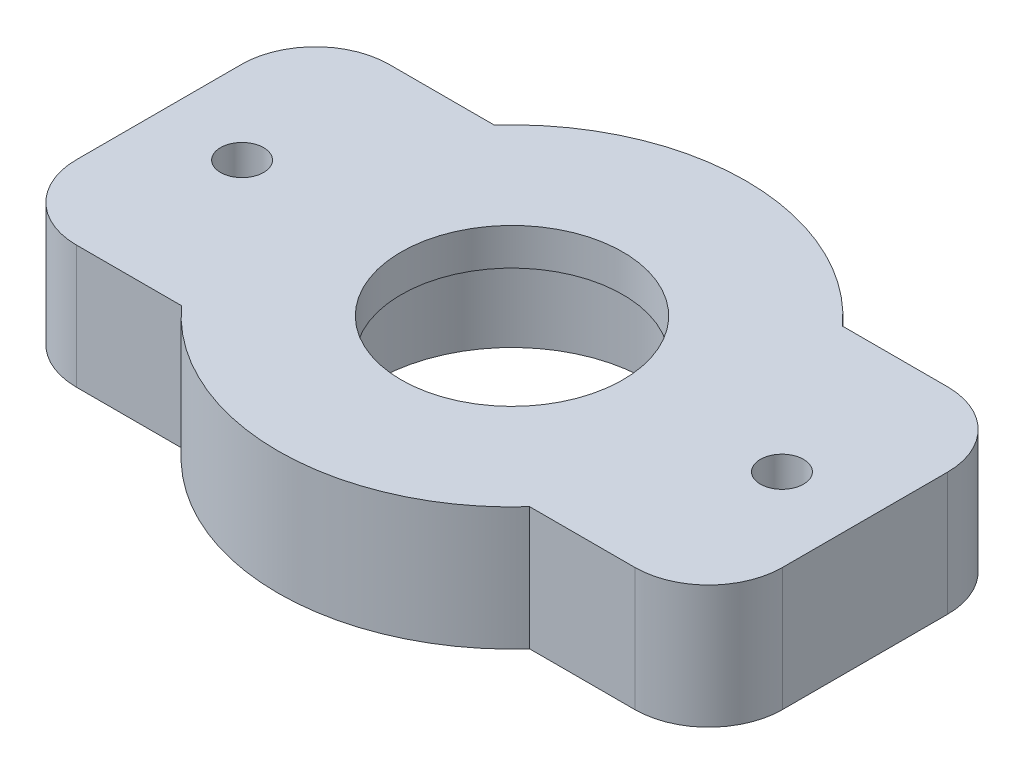
ISO-10303-21;
HEADER;
FILE_DESCRIPTION(('STEP AP214'),'2;1');
FILE_NAME('part.step','',(''),(''),'','','');
FILE_SCHEMA(('AUTOMOTIVE_DESIGN { 1 0 10303 214 1 1 1 1 }'));
ENDSEC;
DATA;
#1=APPLICATION_CONTEXT('core data for automotive mechanical design processes');
#2=APPLICATION_PROTOCOL_DEFINITION('international standard','automotive_design',2000,#1);
#3=PRODUCT_CONTEXT('',#1,'mechanical');
#4=PRODUCT('Part','Part','',(#3));
#5=PRODUCT_RELATED_PRODUCT_CATEGORY('part','',(#4));
#6=PRODUCT_DEFINITION_FORMATION('','',#4);
#7=PRODUCT_DEFINITION_CONTEXT('part definition',#1,'design');
#8=PRODUCT_DEFINITION('design','',#6,#7);
#9=PRODUCT_DEFINITION_SHAPE('','',#8);
#10=(LENGTH_UNIT() NAMED_UNIT(*) SI_UNIT(.MILLI.,.METRE.));
#11=(NAMED_UNIT(*) PLANE_ANGLE_UNIT() SI_UNIT($,.RADIAN.));
#12=(NAMED_UNIT(*) SI_UNIT($,.STERADIAN.) SOLID_ANGLE_UNIT());
#13=UNCERTAINTY_MEASURE_WITH_UNIT(LENGTH_MEASURE(1.E-05),#10,'distance_accuracy_value','');
#14=(GEOMETRIC_REPRESENTATION_CONTEXT(3) GLOBAL_UNCERTAINTY_ASSIGNED_CONTEXT((#13)) GLOBAL_UNIT_ASSIGNED_CONTEXT((#10,
#11,#12)) REPRESENTATION_CONTEXT('',''));
#15=CARTESIAN_POINT('',(0.,0.,0.));
#16=DIRECTION('',(0.,0.,1.));
#17=DIRECTION('',(1.,0.,0.));
#18=AXIS2_PLACEMENT_3D('',#15,#16,#17);
#19=CARTESIAN_POINT('',(0.,10.,0.));
#20=DIRECTION('',(0.,-1.,0.));
#21=DIRECTION('',(0.,0.,-1.));
#22=AXIS2_PLACEMENT_3D('',#19,#20,#21);
#23=CYLINDRICAL_SURFACE('',#22,11.);
#24=CARTESIAN_POINT('',(0.,0.,0.));
#25=DIRECTION('',(0.,1.,0.));
#26=DIRECTION('',(0.,0.,1.));
#27=AXIS2_PLACEMENT_3D('',#24,#25,#26);
#28=CIRCLE('',#27,11.);
#29=CARTESIAN_POINT('',(0.,0.,11.));
#30=VERTEX_POINT('',#29);
#31=EDGE_CURVE('E246',#30,#30,#28,.T.);
#32=ORIENTED_EDGE('',*,*,#31,.F.);
#33=EDGE_LOOP('',(#32));
#34=FACE_BOUND('',#33,.T.);
#35=CARTESIAN_POINT('',(0.,7.,0.));
#36=DIRECTION('',(0.,1.,0.));
#37=DIRECTION('',(0.,0.,1.));
#38=AXIS2_PLACEMENT_3D('',#35,#36,#37);
#39=CIRCLE('',#38,11.);
#40=CARTESIAN_POINT('',(0.,7.,11.));
#41=VERTEX_POINT('',#40);
#42=EDGE_CURVE('E440',#41,#41,#39,.T.);
#43=ORIENTED_EDGE('',*,*,#42,.T.);
#44=EDGE_LOOP('',(#43));
#45=FACE_BOUND('',#44,.T.);
#46=ADVANCED_FACE('F32',(#34,#45),#23,.F.);
#47=CARTESIAN_POINT('',(0.,10.,0.));
#48=DIRECTION('',(0.,1.,0.));
#49=DIRECTION('',(0.,0.,1.));
#50=AXIS2_PLACEMENT_3D('',#47,#48,#49);
#51=PLANE('',#50);
#52=CARTESIAN_POINT('',(21.920310216783,10.,0.));
#53=DIRECTION('',(0.,1.,0.));
#54=DIRECTION('',(0.,0.,1.));
#55=AXIS2_PLACEMENT_3D('',#52,#53,#54);
#56=CIRCLE('',#55,1.75);
#57=CARTESIAN_POINT('',(21.920310216783,10.,1.75));
#58=VERTEX_POINT('',#57);
#59=EDGE_CURVE('E421',#58,#58,#56,.T.);
#60=ORIENTED_EDGE('',*,*,#59,.F.);
#61=EDGE_LOOP('',(#60));
#62=FACE_BOUND('',#61,.T.);
#63=DIRECTION('',(0.,0.,-1.));
#64=VECTOR('',#63,1.);
#65=CARTESIAN_POINT('',(28.670310216783,10.,12.7));
#66=LINE('',#65,#64);
#67=CARTESIAN_POINT('',(28.670310216783,10.,6.7));
#68=VERTEX_POINT('',#67);
#69=CARTESIAN_POINT('',(28.670310216783,10.,-6.7));
#70=VERTEX_POINT('',#69);
#71=EDGE_CURVE('E238',#68,#70,#66,.T.);
#72=ORIENTED_EDGE('',*,*,#71,.T.);
#73=CARTESIAN_POINT('',(22.670310216783,10.,-6.7));
#74=DIRECTION('',(0.,1.,0.));
#75=DIRECTION('',(0.,0.,1.));
#76=AXIS2_PLACEMENT_3D('',#73,#74,#75);
#77=CIRCLE('',#76,6.);
#78=CARTESIAN_POINT('',(22.670310216783,10.,-12.7));
#79=VERTEX_POINT('',#78);
#80=EDGE_CURVE('E177',#70,#79,#77,.T.);
#81=ORIENTED_EDGE('',*,*,#80,.T.);
#82=DIRECTION('',(-1.,0.,0.));
#83=VECTOR('',#82,1.);
#84=CARTESIAN_POINT('',(28.670310216783,10.,-12.7));
#85=LINE('',#84,#83);
#86=CARTESIAN_POINT('',(14.1318788559767,10.,-12.7));
#87=VERTEX_POINT('',#86);
#88=EDGE_CURVE('E140',#79,#87,#85,.T.);
#89=ORIENTED_EDGE('',*,*,#88,.T.);
#90=CARTESIAN_POINT('',(0.,10.,0.));
#91=DIRECTION('',(0.,1.,0.));
#92=DIRECTION('',(0.,0.,1.));
#93=AXIS2_PLACEMENT_3D('',#90,#91,#92);
#94=CIRCLE('',#93,19.);
#95=CARTESIAN_POINT('',(-14.1318788559767,10.,-12.7));
#96=VERTEX_POINT('',#95);
#97=EDGE_CURVE('E133',#87,#96,#94,.T.);
#98=ORIENTED_EDGE('',*,*,#97,.T.);
#99=DIRECTION('',(-1.,0.,0.));
#100=VECTOR('',#99,1.);
#101=CARTESIAN_POINT('',(-14.1318788559767,10.,-12.7));
#102=LINE('',#101,#100);
#103=CARTESIAN_POINT('',(-22.670310216783,10.,-12.7));
#104=VERTEX_POINT('',#103);
#105=EDGE_CURVE('E123',#96,#104,#102,.T.);
#106=ORIENTED_EDGE('',*,*,#105,.T.);
#107=CARTESIAN_POINT('',(-22.670310216783,10.,-6.7));
#108=DIRECTION('',(0.,1.,0.));
#109=DIRECTION('',(0.,0.,1.));
#110=AXIS2_PLACEMENT_3D('',#107,#108,#109);
#111=CIRCLE('',#110,6.);
#112=CARTESIAN_POINT('',(-28.670310216783,10.,-6.7));
#113=VERTEX_POINT('',#112);
#114=EDGE_CURVE('E172',#104,#113,#111,.T.);
#115=ORIENTED_EDGE('',*,*,#114,.T.);
#116=DIRECTION('',(0.,0.,1.));
#117=VECTOR('',#116,1.);
#118=CARTESIAN_POINT('',(-28.670310216783,10.,12.7));
#119=LINE('',#118,#117);
#120=CARTESIAN_POINT('',(-28.670310216783,10.,6.7));
#121=VERTEX_POINT('',#120);
#122=EDGE_CURVE('E132',#113,#121,#119,.T.);
#123=ORIENTED_EDGE('',*,*,#122,.T.);
#124=CARTESIAN_POINT('',(-22.670310216783,10.,6.7));
#125=DIRECTION('',(0.,1.,0.));
#126=DIRECTION('',(0.,0.,1.));
#127=AXIS2_PLACEMENT_3D('',#124,#125,#126);
#128=CIRCLE('',#127,6.);
#129=CARTESIAN_POINT('',(-22.670310216783,10.,12.7));
#130=VERTEX_POINT('',#129);
#131=EDGE_CURVE('E55',#121,#130,#128,.T.);
#132=ORIENTED_EDGE('',*,*,#131,.T.);
#133=DIRECTION('',(1.,0.,0.));
#134=VECTOR('',#133,1.);
#135=CARTESIAN_POINT('',(-14.1318788559767,10.,12.7));
#136=LINE('',#135,#134);
#137=CARTESIAN_POINT('',(-14.1318788559767,10.,12.7));
#138=VERTEX_POINT('',#137);
#139=EDGE_CURVE('E194',#130,#138,#136,.T.);
#140=ORIENTED_EDGE('',*,*,#139,.T.);
#141=CARTESIAN_POINT('',(0.,10.,0.));
#142=DIRECTION('',(0.,1.,0.));
#143=DIRECTION('',(0.,0.,1.));
#144=AXIS2_PLACEMENT_3D('',#141,#142,#143);
#145=CIRCLE('',#144,19.);
#146=CARTESIAN_POINT('',(14.1318788559767,10.,12.7));
#147=VERTEX_POINT('',#146);
#148=EDGE_CURVE('E242',#138,#147,#145,.T.);
#149=ORIENTED_EDGE('',*,*,#148,.T.);
#150=DIRECTION('',(1.,0.,0.));
#151=VECTOR('',#150,1.);
#152=CARTESIAN_POINT('',(28.670310216783,10.,12.7));
#153=LINE('',#152,#151);
#154=CARTESIAN_POINT('',(22.670310216783,10.,12.7));
#155=VERTEX_POINT('',#154);
#156=EDGE_CURVE('E226',#147,#155,#153,.T.);
#157=ORIENTED_EDGE('',*,*,#156,.T.);
#158=CARTESIAN_POINT('',(22.670310216783,10.,6.7));
#159=DIRECTION('',(0.,1.,0.));
#160=DIRECTION('',(0.,0.,1.));
#161=AXIS2_PLACEMENT_3D('',#158,#159,#160);
#162=CIRCLE('',#161,6.);
#163=EDGE_CURVE('E175',#155,#68,#162,.T.);
#164=ORIENTED_EDGE('',*,*,#163,.T.);
#165=EDGE_LOOP('',(#72,#81,#89,#98,#106,#115,#123,#132,#140,#149,#157,#164));
#166=FACE_BOUND('',#165,.T.);
#167=CARTESIAN_POINT('',(-21.920310216783,10.,0.));
#168=DIRECTION('',(0.,1.,0.));
#169=DIRECTION('',(0.,0.,1.));
#170=AXIS2_PLACEMENT_3D('',#167,#168,#169);
#171=CIRCLE('',#170,1.75);
#172=CARTESIAN_POINT('',(-21.920310216783,10.,1.75));
#173=VERTEX_POINT('',#172);
#174=EDGE_CURVE('E426',#173,#173,#171,.T.);
#175=ORIENTED_EDGE('',*,*,#174,.F.);
#176=EDGE_LOOP('',(#175));
#177=FACE_BOUND('',#176,.T.);
#178=CARTESIAN_POINT('',(0.,10.,0.));
#179=DIRECTION('',(0.,1.,0.));
#180=DIRECTION('',(0.,0.,1.));
#181=AXIS2_PLACEMENT_3D('',#178,#179,#180);
#182=CIRCLE('',#181,9.);
#183=CARTESIAN_POINT('',(0.,10.,9.));
#184=VERTEX_POINT('',#183);
#185=EDGE_CURVE('E445',#184,#184,#182,.T.);
#186=ORIENTED_EDGE('',*,*,#185,.F.);
#187=EDGE_LOOP('',(#186));
#188=FACE_BOUND('',#187,.T.);
#189=ADVANCED_FACE('F137',(#62,#166,#177,#188),#51,.T.);
#190=CARTESIAN_POINT('',(0.,0.,0.));
#191=DIRECTION('',(0.,1.,0.));
#192=DIRECTION('',(0.,0.,1.));
#193=AXIS2_PLACEMENT_3D('',#190,#191,#192);
#194=PLANE('',#193);
#195=DIRECTION('',(-1.,0.,0.));
#196=VECTOR('',#195,1.);
#197=CARTESIAN_POINT('',(28.670310216783,0.,-12.7));
#198=LINE('',#197,#196);
#199=CARTESIAN_POINT('',(22.670310216783,0.,-12.7));
#200=VERTEX_POINT('',#199);
#201=CARTESIAN_POINT('',(14.1318788559767,0.,-12.7));
#202=VERTEX_POINT('',#201);
#203=EDGE_CURVE('E144',#200,#202,#198,.T.);
#204=ORIENTED_EDGE('',*,*,#203,.F.);
#205=CARTESIAN_POINT('',(22.670310216783,0.,-6.7));
#206=DIRECTION('',(0.,1.,0.));
#207=DIRECTION('',(0.,0.,1.));
#208=AXIS2_PLACEMENT_3D('',#205,#206,#207);
#209=CIRCLE('',#208,6.);
#210=CARTESIAN_POINT('',(28.670310216783,0.,-6.7));
#211=VERTEX_POINT('',#210);
#212=EDGE_CURVE('E165',#200,#211,#209,.F.);
#213=ORIENTED_EDGE('',*,*,#212,.T.);
#214=DIRECTION('',(0.,0.,-1.));
#215=VECTOR('',#214,1.);
#216=CARTESIAN_POINT('',(28.670310216783,0.,12.7));
#217=LINE('',#216,#215);
#218=CARTESIAN_POINT('',(28.670310216783,0.,6.7));
#219=VERTEX_POINT('',#218);
#220=EDGE_CURVE('E218',#219,#211,#217,.T.);
#221=ORIENTED_EDGE('',*,*,#220,.F.);
#222=CARTESIAN_POINT('',(22.670310216783,0.,6.7));
#223=DIRECTION('',(0.,1.,0.));
#224=DIRECTION('',(0.,0.,1.));
#225=AXIS2_PLACEMENT_3D('',#222,#223,#224);
#226=CIRCLE('',#225,6.);
#227=CARTESIAN_POINT('',(22.670310216783,0.,12.7));
#228=VERTEX_POINT('',#227);
#229=EDGE_CURVE('E163',#219,#228,#226,.F.);
#230=ORIENTED_EDGE('',*,*,#229,.T.);
#231=DIRECTION('',(1.,0.,0.));
#232=VECTOR('',#231,1.);
#233=CARTESIAN_POINT('',(28.670310216783,0.,12.7));
#234=LINE('',#233,#232);
#235=CARTESIAN_POINT('',(14.1318788559767,0.,12.7));
#236=VERTEX_POINT('',#235);
#237=EDGE_CURVE('E211',#236,#228,#234,.T.);
#238=ORIENTED_EDGE('',*,*,#237,.F.);
#239=CARTESIAN_POINT('',(0.,0.,0.));
#240=DIRECTION('',(0.,1.,0.));
#241=DIRECTION('',(0.,0.,1.));
#242=AXIS2_PLACEMENT_3D('',#239,#240,#241);
#243=CIRCLE('',#242,19.);
#244=CARTESIAN_POINT('',(-14.1318788559767,0.,12.7));
#245=VERTEX_POINT('',#244);
#246=EDGE_CURVE('E209',#245,#236,#243,.T.);
#247=ORIENTED_EDGE('',*,*,#246,.F.);
#248=DIRECTION('',(1.,0.,0.));
#249=VECTOR('',#248,1.);
#250=CARTESIAN_POINT('',(-14.1318788559767,0.,12.7));
#251=LINE('',#250,#249);
#252=CARTESIAN_POINT('',(-22.670310216783,0.,12.7));
#253=VERTEX_POINT('',#252);
#254=EDGE_CURVE('E202',#253,#245,#251,.T.);
#255=ORIENTED_EDGE('',*,*,#254,.F.);
#256=CARTESIAN_POINT('',(-22.670310216783,0.,6.7));
#257=DIRECTION('',(0.,1.,0.));
#258=DIRECTION('',(0.,0.,1.));
#259=AXIS2_PLACEMENT_3D('',#256,#257,#258);
#260=CIRCLE('',#259,6.);
#261=CARTESIAN_POINT('',(-28.670310216783,0.,6.7));
#262=VERTEX_POINT('',#261);
#263=EDGE_CURVE('E161',#253,#262,#260,.F.);
#264=ORIENTED_EDGE('',*,*,#263,.T.);
#265=DIRECTION('',(0.,0.,1.));
#266=VECTOR('',#265,1.);
#267=CARTESIAN_POINT('',(-28.670310216783,0.,12.7));
#268=LINE('',#267,#266);
#269=CARTESIAN_POINT('',(-28.670310216783,0.,-6.7));
#270=VERTEX_POINT('',#269);
#271=EDGE_CURVE('E192',#270,#262,#268,.T.);
#272=ORIENTED_EDGE('',*,*,#271,.F.);
#273=CARTESIAN_POINT('',(-22.670310216783,0.,-6.7));
#274=DIRECTION('',(0.,1.,0.));
#275=DIRECTION('',(0.,0.,1.));
#276=AXIS2_PLACEMENT_3D('',#273,#274,#275);
#277=CIRCLE('',#276,6.);
#278=CARTESIAN_POINT('',(-22.670310216783,0.,-12.7));
#279=VERTEX_POINT('',#278);
#280=EDGE_CURVE('E153',#270,#279,#277,.F.);
#281=ORIENTED_EDGE('',*,*,#280,.T.);
#282=DIRECTION('',(-1.,0.,0.));
#283=VECTOR('',#282,1.);
#284=CARTESIAN_POINT('',(-14.1318788559767,0.,-12.7));
#285=LINE('',#284,#283);
#286=CARTESIAN_POINT('',(-14.1318788559767,0.,-12.7));
#287=VERTEX_POINT('',#286);
#288=EDGE_CURVE('E213',#287,#279,#285,.T.);
#289=ORIENTED_EDGE('',*,*,#288,.F.);
#290=CARTESIAN_POINT('',(0.,0.,0.));
#291=DIRECTION('',(0.,1.,0.));
#292=DIRECTION('',(0.,0.,1.));
#293=AXIS2_PLACEMENT_3D('',#290,#291,#292);
#294=CIRCLE('',#293,19.);
#295=EDGE_CURVE('E148',#202,#287,#294,.T.);
#296=ORIENTED_EDGE('',*,*,#295,.F.);
#297=EDGE_LOOP('',(#204,#213,#221,#230,#238,#247,#255,#264,#272,#281,#289,#296));
#298=FACE_BOUND('',#297,.T.);
#299=ORIENTED_EDGE('',*,*,#31,.T.);
#300=EDGE_LOOP('',(#299));
#301=FACE_BOUND('',#300,.T.);
#302=CARTESIAN_POINT('',(21.920310216783,0.,0.));
#303=DIRECTION('',(0.,1.,0.));
#304=DIRECTION('',(0.,0.,1.));
#305=AXIS2_PLACEMENT_3D('',#302,#303,#304);
#306=CIRCLE('',#305,1.75);
#307=CARTESIAN_POINT('',(21.920310216783,0.,1.75));
#308=VERTEX_POINT('',#307);
#309=EDGE_CURVE('E424',#308,#308,#306,.T.);
#310=ORIENTED_EDGE('',*,*,#309,.T.);
#311=EDGE_LOOP('',(#310));
#312=FACE_BOUND('',#311,.T.);
#313=CARTESIAN_POINT('',(-21.920310216783,0.,0.));
#314=DIRECTION('',(0.,1.,0.));
#315=DIRECTION('',(0.,0.,1.));
#316=AXIS2_PLACEMENT_3D('',#313,#314,#315);
#317=CIRCLE('',#316,1.75);
#318=CARTESIAN_POINT('',(-21.920310216783,0.,1.75));
#319=VERTEX_POINT('',#318);
#320=EDGE_CURVE('E430',#319,#319,#317,.T.);
#321=ORIENTED_EDGE('',*,*,#320,.T.);
#322=EDGE_LOOP('',(#321));
#323=FACE_BOUND('',#322,.T.);
#324=ADVANCED_FACE('F206',(#298,#301,#312,#323),#194,.F.);
#325=CARTESIAN_POINT('',(0.,10.,0.));
#326=DIRECTION('',(0.,-1.,0.));
#327=DIRECTION('',(0.,0.,-1.));
#328=AXIS2_PLACEMENT_3D('',#325,#326,#327);
#329=CYLINDRICAL_SURFACE('',#328,19.);
#330=ORIENTED_EDGE('',*,*,#295,.T.);
#331=DIRECTION('',(0.,-1.,0.));
#332=VECTOR('',#331,1.);
#333=CARTESIAN_POINT('',(-14.1318788559767,10.,-12.7));
#334=LINE('',#333,#332);
#335=EDGE_CURVE('E128',#96,#287,#334,.T.);
#336=ORIENTED_EDGE('',*,*,#335,.F.);
#337=ORIENTED_EDGE('',*,*,#97,.F.);
#338=DIRECTION('',(0.,-1.,0.));
#339=VECTOR('',#338,1.);
#340=CARTESIAN_POINT('',(14.1318788559767,10.,-12.7));
#341=LINE('',#340,#339);
#342=EDGE_CURVE('E222',#87,#202,#341,.T.);
#343=ORIENTED_EDGE('',*,*,#342,.T.);
#344=EDGE_LOOP('',(#330,#336,#337,#343));
#345=FACE_BOUND('',#344,.T.);
#346=ADVANCED_FACE('F146',(#345),#329,.T.);
#347=CARTESIAN_POINT('',(-14.1318788559767,10.,-12.7));
#348=DIRECTION('',(0.,0.,1.));
#349=DIRECTION('',(1.,0.,0.));
#350=AXIS2_PLACEMENT_3D('',#347,#348,#349);
#351=PLANE('',#350);
#352=ORIENTED_EDGE('',*,*,#288,.T.);
#353=DIRECTION('',(0.,-1.,0.));
#354=VECTOR('',#353,1.);
#355=CARTESIAN_POINT('',(-22.670310216783,10.,-12.7));
#356=LINE('',#355,#354);
#357=EDGE_CURVE('E11',#279,#104,#356,.F.);
#358=ORIENTED_EDGE('',*,*,#357,.T.);
#359=ORIENTED_EDGE('',*,*,#105,.F.);
#360=ORIENTED_EDGE('',*,*,#335,.T.);
#361=EDGE_LOOP('',(#352,#358,#359,#360));
#362=FACE_BOUND('',#361,.T.);
#363=ADVANCED_FACE('F126',(#362),#351,.F.);
#364=CARTESIAN_POINT('',(-28.670310216783,10.,12.7));
#365=DIRECTION('',(1.,0.,0.));
#366=DIRECTION('',(0.,0.,-1.));
#367=AXIS2_PLACEMENT_3D('',#364,#365,#366);
#368=PLANE('',#367);
#369=ORIENTED_EDGE('',*,*,#271,.T.);
#370=DIRECTION('',(0.,-1.,0.));
#371=VECTOR('',#370,1.);
#372=CARTESIAN_POINT('',(-28.670310216783,10.,6.7));
#373=LINE('',#372,#371);
#374=EDGE_CURVE('E40',#262,#121,#373,.F.);
#375=ORIENTED_EDGE('',*,*,#374,.T.);
#376=ORIENTED_EDGE('',*,*,#122,.F.);
#377=DIRECTION('',(0.,-1.,0.));
#378=VECTOR('',#377,1.);
#379=CARTESIAN_POINT('',(-28.670310216783,10.,-6.7));
#380=LINE('',#379,#378);
#381=EDGE_CURVE('E183',#113,#270,#380,.T.);
#382=ORIENTED_EDGE('',*,*,#381,.T.);
#383=EDGE_LOOP('',(#369,#375,#376,#382));
#384=FACE_BOUND('',#383,.T.);
#385=ADVANCED_FACE('F189',(#384),#368,.F.);
#386=CARTESIAN_POINT('',(-14.1318788559767,10.,12.7));
#387=DIRECTION('',(0.,0.,-1.));
#388=DIRECTION('',(-1.,0.,0.));
#389=AXIS2_PLACEMENT_3D('',#386,#387,#388);
#390=PLANE('',#389);
#391=ORIENTED_EDGE('',*,*,#139,.F.);
#392=DIRECTION('',(0.,-1.,0.));
#393=VECTOR('',#392,1.);
#394=CARTESIAN_POINT('',(-22.670310216783,10.,12.7));
#395=LINE('',#394,#393);
#396=EDGE_CURVE('E180',#130,#253,#395,.T.);
#397=ORIENTED_EDGE('',*,*,#396,.T.);
#398=ORIENTED_EDGE('',*,*,#254,.T.);
#399=DIRECTION('',(0.,-1.,0.));
#400=VECTOR('',#399,1.);
#401=CARTESIAN_POINT('',(-14.1318788559767,10.,12.7));
#402=LINE('',#401,#400);
#403=EDGE_CURVE('E150',#138,#245,#402,.T.);
#404=ORIENTED_EDGE('',*,*,#403,.F.);
#405=EDGE_LOOP('',(#391,#397,#398,#404));
#406=FACE_BOUND('',#405,.T.);
#407=ADVANCED_FACE('F200',(#406),#390,.F.);
#408=CARTESIAN_POINT('',(0.,10.,0.));
#409=DIRECTION('',(0.,-1.,0.));
#410=DIRECTION('',(0.,0.,-1.));
#411=AXIS2_PLACEMENT_3D('',#408,#409,#410);
#412=CYLINDRICAL_SURFACE('',#411,19.);
#413=ORIENTED_EDGE('',*,*,#246,.T.);
#414=DIRECTION('',(0.,-1.,0.));
#415=VECTOR('',#414,1.);
#416=CARTESIAN_POINT('',(14.1318788559767,10.,12.7));
#417=LINE('',#416,#415);
#418=EDGE_CURVE('E156',#147,#236,#417,.T.);
#419=ORIENTED_EDGE('',*,*,#418,.F.);
#420=ORIENTED_EDGE('',*,*,#148,.F.);
#421=ORIENTED_EDGE('',*,*,#403,.T.);
#422=EDGE_LOOP('',(#413,#419,#420,#421));
#423=FACE_BOUND('',#422,.T.);
#424=ADVANCED_FACE('F276',(#423),#412,.T.);
#425=CARTESIAN_POINT('',(28.670310216783,10.,12.7));
#426=DIRECTION('',(0.,0.,-1.));
#427=DIRECTION('',(-1.,0.,0.));
#428=AXIS2_PLACEMENT_3D('',#425,#426,#427);
#429=PLANE('',#428);
#430=ORIENTED_EDGE('',*,*,#237,.T.);
#431=DIRECTION('',(0.,-1.,0.));
#432=VECTOR('',#431,1.);
#433=CARTESIAN_POINT('',(22.670310216783,10.,12.7));
#434=LINE('',#433,#432);
#435=EDGE_CURVE('E47',#228,#155,#434,.F.);
#436=ORIENTED_EDGE('',*,*,#435,.T.);
#437=ORIENTED_EDGE('',*,*,#156,.F.);
#438=ORIENTED_EDGE('',*,*,#418,.T.);
#439=EDGE_LOOP('',(#430,#436,#437,#438));
#440=FACE_BOUND('',#439,.T.);
#441=ADVANCED_FACE('F225',(#440),#429,.F.);
#442=CARTESIAN_POINT('',(28.670310216783,10.,12.7));
#443=DIRECTION('',(-1.,0.,0.));
#444=DIRECTION('',(0.,0.,1.));
#445=AXIS2_PLACEMENT_3D('',#442,#443,#444);
#446=PLANE('',#445);
#447=ORIENTED_EDGE('',*,*,#220,.T.);
#448=DIRECTION('',(0.,-1.,0.));
#449=VECTOR('',#448,1.);
#450=CARTESIAN_POINT('',(28.670310216783,10.,-6.7));
#451=LINE('',#450,#449);
#452=EDGE_CURVE('E170',#211,#70,#451,.F.);
#453=ORIENTED_EDGE('',*,*,#452,.T.);
#454=ORIENTED_EDGE('',*,*,#71,.F.);
#455=DIRECTION('',(0.,-1.,0.));
#456=VECTOR('',#455,1.);
#457=CARTESIAN_POINT('',(28.670310216783,10.,6.7));
#458=LINE('',#457,#456);
#459=EDGE_CURVE('E167',#68,#219,#458,.T.);
#460=ORIENTED_EDGE('',*,*,#459,.T.);
#461=EDGE_LOOP('',(#447,#453,#454,#460));
#462=FACE_BOUND('',#461,.T.);
#463=ADVANCED_FACE('F236',(#462),#446,.F.);
#464=CARTESIAN_POINT('',(28.670310216783,10.,-12.7));
#465=DIRECTION('',(0.,0.,1.));
#466=DIRECTION('',(1.,0.,0.));
#467=AXIS2_PLACEMENT_3D('',#464,#465,#466);
#468=PLANE('',#467);
#469=ORIENTED_EDGE('',*,*,#88,.F.);
#470=DIRECTION('',(0.,-1.,0.));
#471=VECTOR('',#470,1.);
#472=CARTESIAN_POINT('',(22.670310216783,10.,-12.7));
#473=LINE('',#472,#471);
#474=EDGE_CURVE('E149',#79,#200,#473,.T.);
#475=ORIENTED_EDGE('',*,*,#474,.T.);
#476=ORIENTED_EDGE('',*,*,#203,.T.);
#477=ORIENTED_EDGE('',*,*,#342,.F.);
#478=EDGE_LOOP('',(#469,#475,#476,#477));
#479=FACE_BOUND('',#478,.T.);
#480=ADVANCED_FACE('F268',(#479),#468,.F.);
#481=CARTESIAN_POINT('',(21.920310216783,10.,0.));
#482=DIRECTION('',(0.,-1.,0.));
#483=DIRECTION('',(0.,0.,-1.));
#484=AXIS2_PLACEMENT_3D('',#481,#482,#483);
#485=CYLINDRICAL_SURFACE('',#484,1.75);
#486=ORIENTED_EDGE('',*,*,#59,.T.);
#487=EDGE_LOOP('',(#486));
#488=FACE_BOUND('',#487,.T.);
#489=ORIENTED_EDGE('',*,*,#309,.F.);
#490=EDGE_LOOP('',(#489));
#491=FACE_BOUND('',#490,.T.);
#492=ADVANCED_FACE('F263',(#488,#491),#485,.F.);
#493=CARTESIAN_POINT('',(-21.920310216783,10.,0.));
#494=DIRECTION('',(0.,-1.,0.));
#495=DIRECTION('',(0.,0.,-1.));
#496=AXIS2_PLACEMENT_3D('',#493,#494,#495);
#497=CYLINDRICAL_SURFACE('',#496,1.75);
#498=ORIENTED_EDGE('',*,*,#174,.T.);
#499=EDGE_LOOP('',(#498));
#500=FACE_BOUND('',#499,.T.);
#501=ORIENTED_EDGE('',*,*,#320,.F.);
#502=EDGE_LOOP('',(#501));
#503=FACE_BOUND('',#502,.T.);
#504=ADVANCED_FACE('F332',(#500,#503),#497,.F.);
#505=CARTESIAN_POINT('',(0.,7.,0.));
#506=DIRECTION('',(0.,1.,0.));
#507=DIRECTION('',(0.,0.,1.));
#508=AXIS2_PLACEMENT_3D('',#505,#506,#507);
#509=PLANE('',#508);
#510=CARTESIAN_POINT('',(0.,7.,0.));
#511=DIRECTION('',(0.,1.,0.));
#512=DIRECTION('',(0.,0.,1.));
#513=AXIS2_PLACEMENT_3D('',#510,#511,#512);
#514=CIRCLE('',#513,9.);
#515=CARTESIAN_POINT('',(0.,7.,9.));
#516=VERTEX_POINT('',#515);
#517=EDGE_CURVE('E442',#516,#516,#514,.T.);
#518=ORIENTED_EDGE('',*,*,#517,.T.);
#519=EDGE_LOOP('',(#518));
#520=FACE_BOUND('',#519,.T.);
#521=ORIENTED_EDGE('',*,*,#42,.F.);
#522=EDGE_LOOP('',(#521));
#523=FACE_BOUND('',#522,.T.);
#524=ADVANCED_FACE('F322',(#520,#523),#509,.F.);
#525=CARTESIAN_POINT('',(0.,7.,0.));
#526=DIRECTION('',(0.,1.,0.));
#527=DIRECTION('',(0.,0.,1.));
#528=AXIS2_PLACEMENT_3D('',#525,#526,#527);
#529=CYLINDRICAL_SURFACE('',#528,9.);
#530=ORIENTED_EDGE('',*,*,#517,.F.);
#531=EDGE_LOOP('',(#530));
#532=FACE_BOUND('',#531,.T.);
#533=ORIENTED_EDGE('',*,*,#185,.T.);
#534=EDGE_LOOP('',(#533));
#535=FACE_BOUND('',#534,.T.);
#536=ADVANCED_FACE('F290',(#532,#535),#529,.F.);
#537=CARTESIAN_POINT('',(22.670310216783,10.,-6.7));
#538=DIRECTION('',(0.,-1.,0.));
#539=DIRECTION('',(0.,0.,-1.));
#540=AXIS2_PLACEMENT_3D('',#537,#538,#539);
#541=CYLINDRICAL_SURFACE('',#540,6.);
#542=ORIENTED_EDGE('',*,*,#80,.F.);
#543=ORIENTED_EDGE('',*,*,#452,.F.);
#544=ORIENTED_EDGE('',*,*,#212,.F.);
#545=ORIENTED_EDGE('',*,*,#474,.F.);
#546=EDGE_LOOP('',(#542,#543,#544,#545));
#547=FACE_BOUND('',#546,.T.);
#548=ADVANCED_FACE('F287',(#547),#541,.T.);
#549=CARTESIAN_POINT('',(22.670310216783,10.,6.7));
#550=DIRECTION('',(0.,-1.,0.));
#551=DIRECTION('',(0.,0.,-1.));
#552=AXIS2_PLACEMENT_3D('',#549,#550,#551);
#553=CYLINDRICAL_SURFACE('',#552,6.);
#554=ORIENTED_EDGE('',*,*,#163,.F.);
#555=ORIENTED_EDGE('',*,*,#435,.F.);
#556=ORIENTED_EDGE('',*,*,#229,.F.);
#557=ORIENTED_EDGE('',*,*,#459,.F.);
#558=EDGE_LOOP('',(#554,#555,#556,#557));
#559=FACE_BOUND('',#558,.T.);
#560=ADVANCED_FACE('F233',(#559),#553,.T.);
#561=CARTESIAN_POINT('',(-22.670310216783,10.,6.7));
#562=DIRECTION('',(0.,-1.,0.));
#563=DIRECTION('',(0.,0.,-1.));
#564=AXIS2_PLACEMENT_3D('',#561,#562,#563);
#565=CYLINDRICAL_SURFACE('',#564,6.);
#566=ORIENTED_EDGE('',*,*,#131,.F.);
#567=ORIENTED_EDGE('',*,*,#374,.F.);
#568=ORIENTED_EDGE('',*,*,#263,.F.);
#569=ORIENTED_EDGE('',*,*,#396,.F.);
#570=EDGE_LOOP('',(#566,#567,#568,#569));
#571=FACE_BOUND('',#570,.T.);
#572=ADVANCED_FACE('F197',(#571),#565,.T.);
#573=CARTESIAN_POINT('',(-22.670310216783,10.,-6.7));
#574=DIRECTION('',(0.,-1.,0.));
#575=DIRECTION('',(0.,0.,-1.));
#576=AXIS2_PLACEMENT_3D('',#573,#574,#575);
#577=CYLINDRICAL_SURFACE('',#576,6.);
#578=ORIENTED_EDGE('',*,*,#114,.F.);
#579=ORIENTED_EDGE('',*,*,#357,.F.);
#580=ORIENTED_EDGE('',*,*,#280,.F.);
#581=ORIENTED_EDGE('',*,*,#381,.F.);
#582=EDGE_LOOP('',(#578,#579,#580,#581));
#583=FACE_BOUND('',#582,.T.);
#584=ADVANCED_FACE('F34',(#583),#577,.T.);
#585=CLOSED_SHELL('',(#46,#189,#324,#346,#363,#385,#407,#424,#441,#463,#480,#492,#504,#524,#536,
#548,#560,#572,#584));
#586=MANIFOLD_SOLID_BREP('B2',#585);
#587=ADVANCED_BREP_SHAPE_REPRESENTATION('',(#18,#586),#14);
#588=SHAPE_DEFINITION_REPRESENTATION(#9,#587);
ENDSEC;
END-ISO-10303-21;
